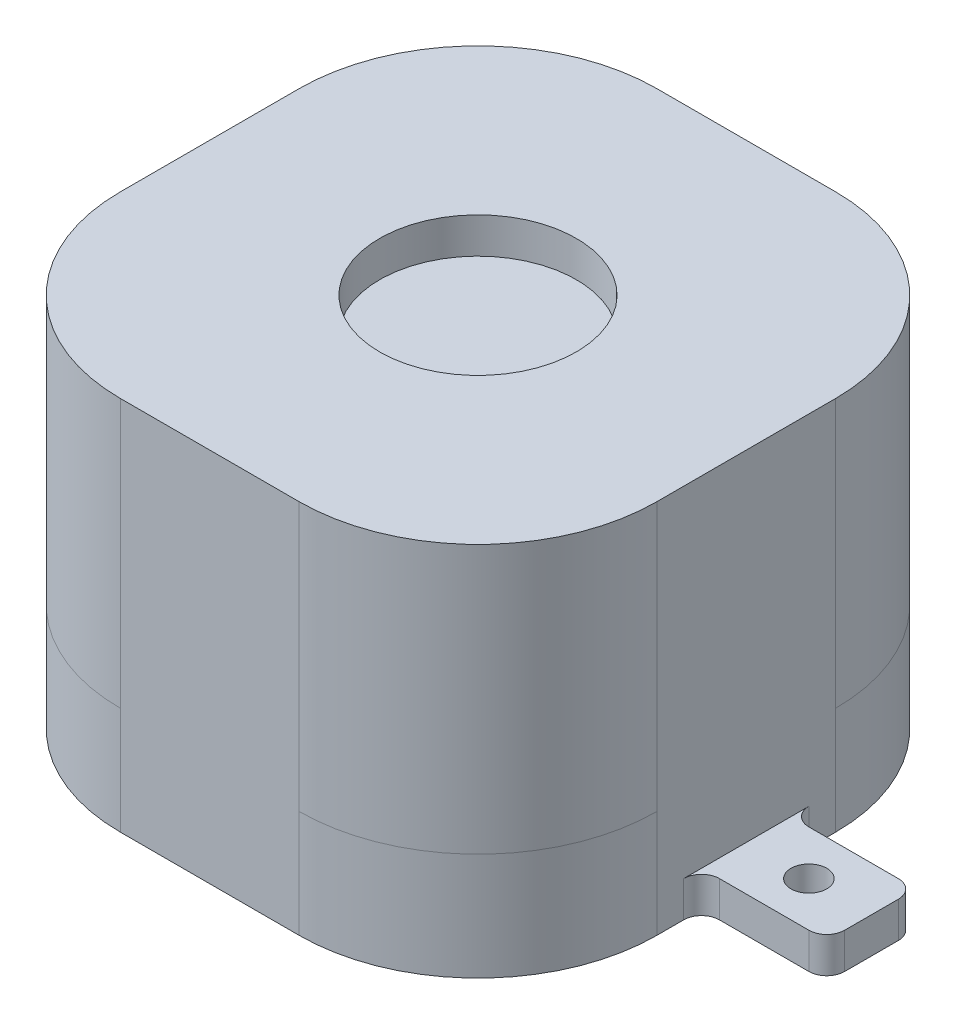
ISO-10303-21;
HEADER;
FILE_DESCRIPTION(('STEP AP214'),'2;1');
FILE_NAME('part.step','',(''),(''),'','','');
FILE_SCHEMA(('AUTOMOTIVE_DESIGN { 1 0 10303 214 1 1 1 1 }'));
ENDSEC;
DATA;
#1=APPLICATION_CONTEXT('core data for automotive mechanical design processes');
#2=APPLICATION_PROTOCOL_DEFINITION('international standard','automotive_design',2000,#1);
#3=PRODUCT_CONTEXT('',#1,'mechanical');
#4=PRODUCT('Part','Part','',(#3));
#5=PRODUCT_RELATED_PRODUCT_CATEGORY('part','',(#4));
#6=PRODUCT_DEFINITION_FORMATION('','',#4);
#7=PRODUCT_DEFINITION_CONTEXT('part definition',#1,'design');
#8=PRODUCT_DEFINITION('design','',#6,#7);
#9=PRODUCT_DEFINITION_SHAPE('','',#8);
#10=(LENGTH_UNIT() NAMED_UNIT(*) SI_UNIT(.MILLI.,.METRE.));
#11=(NAMED_UNIT(*) PLANE_ANGLE_UNIT() SI_UNIT($,.RADIAN.));
#12=(NAMED_UNIT(*) SI_UNIT($,.STERADIAN.) SOLID_ANGLE_UNIT());
#13=UNCERTAINTY_MEASURE_WITH_UNIT(LENGTH_MEASURE(1.E-05),#10,'distance_accuracy_value','');
#14=(GEOMETRIC_REPRESENTATION_CONTEXT(3) GLOBAL_UNCERTAINTY_ASSIGNED_CONTEXT((#13)) GLOBAL_UNIT_ASSIGNED_CONTEXT((#10,
#11,#12)) REPRESENTATION_CONTEXT('',''));
#15=CARTESIAN_POINT('',(0.,0.,0.));
#16=DIRECTION('',(0.,0.,1.));
#17=DIRECTION('',(1.,0.,0.));
#18=AXIS2_PLACEMENT_3D('',#15,#16,#17);
#19=CARTESIAN_POINT('',(-15.,6.,15.));
#20=DIRECTION('',(1.,0.,0.));
#21=DIRECTION('',(0.,0.,-1.));
#22=AXIS2_PLACEMENT_3D('',#19,#20,#21);
#23=PLANE('',#22);
#24=DIRECTION('',(0.,0.,1.));
#25=VECTOR('',#24,1.);
#26=CARTESIAN_POINT('',(-15.,21.,15.));
#27=LINE('',#26,#25);
#28=CARTESIAN_POINT('',(-15.,21.,-4.99999999999999));
#29=VERTEX_POINT('',#28);
#30=CARTESIAN_POINT('',(-15.,21.,5.));
#31=VERTEX_POINT('',#30);
#32=EDGE_CURVE('E424',#29,#31,#27,.T.);
#33=ORIENTED_EDGE('',*,*,#32,.F.);
#34=DIRECTION('',(0.,-1.,0.));
#35=VECTOR('',#34,1.);
#36=CARTESIAN_POINT('',(-15.,6.,-4.99999999999999));
#37=LINE('',#36,#35);
#38=CARTESIAN_POINT('',(-15.,6.,-4.99999999999999));
#39=VERTEX_POINT('',#38);
#40=EDGE_CURVE('E11',#29,#39,#37,.T.);
#41=ORIENTED_EDGE('',*,*,#40,.T.);
#42=DIRECTION('',(0.,-1.,0.));
#43=VECTOR('',#42,1.);
#44=CARTESIAN_POINT('',(-15.,6.,-4.99999999999999));
#45=LINE('',#44,#43);
#46=CARTESIAN_POINT('',(-15.,0.,-4.99999999999999));
#47=VERTEX_POINT('',#46);
#48=EDGE_CURVE('E284',#39,#47,#45,.T.);
#49=ORIENTED_EDGE('',*,*,#48,.T.);
#50=DIRECTION('',(0.,0.,1.));
#51=VECTOR('',#50,1.);
#52=CARTESIAN_POINT('',(-15.,0.,15.));
#53=LINE('',#52,#51);
#54=CARTESIAN_POINT('',(-15.,0.,-3.5));
#55=VERTEX_POINT('',#54);
#56=EDGE_CURVE('E516',#47,#55,#53,.T.);
#57=ORIENTED_EDGE('',*,*,#56,.T.);
#58=DIRECTION('',(0.,-1.,0.));
#59=VECTOR('',#58,1.);
#60=CARTESIAN_POINT('',(-15.,2.,-3.5));
#61=LINE('',#60,#59);
#62=CARTESIAN_POINT('',(-15.,2.,-3.5));
#63=VERTEX_POINT('',#62);
#64=EDGE_CURVE('E335',#55,#63,#61,.F.);
#65=ORIENTED_EDGE('',*,*,#64,.T.);
#66=DIRECTION('',(0.,0.,-1.));
#67=VECTOR('',#66,1.);
#68=CARTESIAN_POINT('',(-15.,2.,-2.5));
#69=LINE('',#68,#67);
#70=CARTESIAN_POINT('',(-15.,2.,3.5));
#71=VERTEX_POINT('',#70);
#72=EDGE_CURVE('E454',#71,#63,#69,.T.);
#73=ORIENTED_EDGE('',*,*,#72,.F.);
#74=DIRECTION('',(0.,-1.,0.));
#75=VECTOR('',#74,1.);
#76=CARTESIAN_POINT('',(-15.,0.,3.5));
#77=LINE('',#76,#75);
#78=CARTESIAN_POINT('',(-15.,0.,3.5));
#79=VERTEX_POINT('',#78);
#80=EDGE_CURVE('E339',#71,#79,#77,.T.);
#81=ORIENTED_EDGE('',*,*,#80,.T.);
#82=CARTESIAN_POINT('',(-15.,0.,5.));
#83=VERTEX_POINT('',#82);
#84=EDGE_CURVE('E505',#79,#83,#53,.T.);
#85=ORIENTED_EDGE('',*,*,#84,.T.);
#86=DIRECTION('',(0.,-1.,0.));
#87=VECTOR('',#86,1.);
#88=CARTESIAN_POINT('',(-15.,6.,5.));
#89=LINE('',#88,#87);
#90=CARTESIAN_POINT('',(-15.,6.,5.));
#91=VERTEX_POINT('',#90);
#92=EDGE_CURVE('E281',#83,#91,#89,.F.);
#93=ORIENTED_EDGE('',*,*,#92,.T.);
#94=DIRECTION('',(0.,-1.,0.));
#95=VECTOR('',#94,1.);
#96=CARTESIAN_POINT('',(-15.,6.,5.));
#97=LINE('',#96,#95);
#98=EDGE_CURVE('E50',#91,#31,#97,.F.);
#99=ORIENTED_EDGE('',*,*,#98,.T.);
#100=EDGE_LOOP('',(#33,#41,#49,#57,#65,#73,#81,#85,#93,#99));
#101=FACE_BOUND('',#100,.T.);
#102=ADVANCED_FACE('F41',(#101),#23,.F.);
#103=CARTESIAN_POINT('',(15.,6.,15.));
#104=DIRECTION('',(0.,0.,-1.));
#105=DIRECTION('',(-1.,0.,0.));
#106=AXIS2_PLACEMENT_3D('',#103,#104,#105);
#107=PLANE('',#106);
#108=DIRECTION('',(0.,-1.,0.));
#109=VECTOR('',#108,1.);
#110=CARTESIAN_POINT('',(5.,6.,15.));
#111=LINE('',#110,#109);
#112=CARTESIAN_POINT('',(5.,0.,15.));
#113=VERTEX_POINT('',#112);
#114=CARTESIAN_POINT('',(5.,6.,15.));
#115=VERTEX_POINT('',#114);
#116=EDGE_CURVE('E238',#113,#115,#111,.F.);
#117=ORIENTED_EDGE('',*,*,#116,.T.);
#118=DIRECTION('',(0.,-1.,0.));
#119=VECTOR('',#118,1.);
#120=CARTESIAN_POINT('',(5.,6.,15.));
#121=LINE('',#120,#119);
#122=CARTESIAN_POINT('',(5.,21.,15.));
#123=VERTEX_POINT('',#122);
#124=EDGE_CURVE('E250',#115,#123,#121,.F.);
#125=ORIENTED_EDGE('',*,*,#124,.T.);
#126=DIRECTION('',(1.,0.,0.));
#127=VECTOR('',#126,1.);
#128=CARTESIAN_POINT('',(15.,21.,15.));
#129=LINE('',#128,#127);
#130=CARTESIAN_POINT('',(-5.,21.,15.));
#131=VERTEX_POINT('',#130);
#132=EDGE_CURVE('E248',#131,#123,#129,.T.);
#133=ORIENTED_EDGE('',*,*,#132,.F.);
#134=DIRECTION('',(0.,-1.,0.));
#135=VECTOR('',#134,1.);
#136=CARTESIAN_POINT('',(-4.99999999999999,6.,15.));
#137=LINE('',#136,#135);
#138=CARTESIAN_POINT('',(-4.99999999999999,6.,15.));
#139=VERTEX_POINT('',#138);
#140=EDGE_CURVE('E232',#131,#139,#137,.T.);
#141=ORIENTED_EDGE('',*,*,#140,.T.);
#142=DIRECTION('',(0.,-1.,0.));
#143=VECTOR('',#142,1.);
#144=CARTESIAN_POINT('',(-4.99999999999999,6.,15.));
#145=LINE('',#144,#143);
#146=CARTESIAN_POINT('',(-4.99999999999999,0.,15.));
#147=VERTEX_POINT('',#146);
#148=EDGE_CURVE('E245',#139,#147,#145,.T.);
#149=ORIENTED_EDGE('',*,*,#148,.T.);
#150=DIRECTION('',(1.,0.,0.));
#151=VECTOR('',#150,1.);
#152=CARTESIAN_POINT('',(15.,0.,15.));
#153=LINE('',#152,#151);
#154=EDGE_CURVE('E520',#147,#113,#153,.T.);
#155=ORIENTED_EDGE('',*,*,#154,.T.);
#156=EDGE_LOOP('',(#117,#125,#133,#141,#149,#155));
#157=FACE_BOUND('',#156,.T.);
#158=ADVANCED_FACE('F243',(#157),#107,.F.);
#159=CARTESIAN_POINT('',(15.,6.,15.));
#160=DIRECTION('',(-1.,0.,0.));
#161=DIRECTION('',(0.,0.,1.));
#162=AXIS2_PLACEMENT_3D('',#159,#160,#161);
#163=PLANE('',#162);
#164=DIRECTION('',(0.,0.,-1.));
#165=VECTOR('',#164,1.);
#166=CARTESIAN_POINT('',(15.,21.,15.));
#167=LINE('',#166,#165);
#168=CARTESIAN_POINT('',(15.,21.,5.));
#169=VERTEX_POINT('',#168);
#170=CARTESIAN_POINT('',(15.,21.,-5.));
#171=VERTEX_POINT('',#170);
#172=EDGE_CURVE('E433',#169,#171,#167,.T.);
#173=ORIENTED_EDGE('',*,*,#172,.F.);
#174=DIRECTION('',(0.,-1.,0.));
#175=VECTOR('',#174,1.);
#176=CARTESIAN_POINT('',(15.,6.,5.));
#177=LINE('',#176,#175);
#178=CARTESIAN_POINT('',(15.,6.,5.));
#179=VERTEX_POINT('',#178);
#180=EDGE_CURVE('E251',#169,#179,#177,.T.);
#181=ORIENTED_EDGE('',*,*,#180,.T.);
#182=DIRECTION('',(0.,-1.,0.));
#183=VECTOR('',#182,1.);
#184=CARTESIAN_POINT('',(15.,6.,5.));
#185=LINE('',#184,#183);
#186=CARTESIAN_POINT('',(15.,0.,5.));
#187=VERTEX_POINT('',#186);
#188=EDGE_CURVE('E535',#179,#187,#185,.T.);
#189=ORIENTED_EDGE('',*,*,#188,.T.);
#190=DIRECTION('',(0.,0.,-1.));
#191=VECTOR('',#190,1.);
#192=CARTESIAN_POINT('',(15.,0.,15.));
#193=LINE('',#192,#191);
#194=CARTESIAN_POINT('',(15.,0.,3.5));
#195=VERTEX_POINT('',#194);
#196=EDGE_CURVE('E524',#187,#195,#193,.T.);
#197=ORIENTED_EDGE('',*,*,#196,.T.);
#198=DIRECTION('',(0.,-1.,0.));
#199=VECTOR('',#198,1.);
#200=CARTESIAN_POINT('',(15.,6.,3.5));
#201=LINE('',#200,#199);
#202=CARTESIAN_POINT('',(15.,2.,3.5));
#203=VERTEX_POINT('',#202);
#204=EDGE_CURVE('E320',#195,#203,#201,.F.);
#205=ORIENTED_EDGE('',*,*,#204,.T.);
#206=DIRECTION('',(0.,0.,-1.));
#207=VECTOR('',#206,1.);
#208=CARTESIAN_POINT('',(15.,2.,-2.5));
#209=LINE('',#208,#207);
#210=CARTESIAN_POINT('',(15.,2.,-3.5));
#211=VERTEX_POINT('',#210);
#212=EDGE_CURVE('E489',#203,#211,#209,.T.);
#213=ORIENTED_EDGE('',*,*,#212,.T.);
#214=DIRECTION('',(0.,-1.,0.));
#215=VECTOR('',#214,1.);
#216=CARTESIAN_POINT('',(15.,6.,-3.5));
#217=LINE('',#216,#215);
#218=CARTESIAN_POINT('',(15.,0.,-3.5));
#219=VERTEX_POINT('',#218);
#220=EDGE_CURVE('E324',#211,#219,#217,.T.);
#221=ORIENTED_EDGE('',*,*,#220,.T.);
#222=CARTESIAN_POINT('',(15.,0.,-5.));
#223=VERTEX_POINT('',#222);
#224=EDGE_CURVE('E523',#219,#223,#193,.T.);
#225=ORIENTED_EDGE('',*,*,#224,.T.);
#226=DIRECTION('',(0.,-1.,0.));
#227=VECTOR('',#226,1.);
#228=CARTESIAN_POINT('',(15.,6.,-5.));
#229=LINE('',#228,#227);
#230=CARTESIAN_POINT('',(15.,6.,-5.));
#231=VERTEX_POINT('',#230);
#232=EDGE_CURVE('E532',#223,#231,#229,.F.);
#233=ORIENTED_EDGE('',*,*,#232,.T.);
#234=DIRECTION('',(0.,-1.,0.));
#235=VECTOR('',#234,1.);
#236=CARTESIAN_POINT('',(15.,6.,-5.));
#237=LINE('',#236,#235);
#238=EDGE_CURVE('E396',#231,#171,#237,.F.);
#239=ORIENTED_EDGE('',*,*,#238,.T.);
#240=EDGE_LOOP('',(#173,#181,#189,#197,#205,#213,#221,#225,#233,#239));
#241=FACE_BOUND('',#240,.T.);
#242=ADVANCED_FACE('F558',(#241),#163,.F.);
#243=CARTESIAN_POINT('',(15.,6.,-15.));
#244=DIRECTION('',(0.,0.,1.));
#245=DIRECTION('',(1.,0.,0.));
#246=AXIS2_PLACEMENT_3D('',#243,#244,#245);
#247=PLANE('',#246);
#248=DIRECTION('',(-1.,0.,0.));
#249=VECTOR('',#248,1.);
#250=CARTESIAN_POINT('',(15.,21.,-15.));
#251=LINE('',#250,#249);
#252=CARTESIAN_POINT('',(5.,21.,-15.));
#253=VERTEX_POINT('',#252);
#254=CARTESIAN_POINT('',(-5.,21.,-15.));
#255=VERTEX_POINT('',#254);
#256=EDGE_CURVE('E442',#253,#255,#251,.T.);
#257=ORIENTED_EDGE('',*,*,#256,.F.);
#258=DIRECTION('',(0.,-1.,0.));
#259=VECTOR('',#258,1.);
#260=CARTESIAN_POINT('',(5.,6.,-15.));
#261=LINE('',#260,#259);
#262=CARTESIAN_POINT('',(5.,6.,-15.));
#263=VERTEX_POINT('',#262);
#264=EDGE_CURVE('E417',#253,#263,#261,.T.);
#265=ORIENTED_EDGE('',*,*,#264,.T.);
#266=DIRECTION('',(0.,-1.,0.));
#267=VECTOR('',#266,1.);
#268=CARTESIAN_POINT('',(5.,6.,-15.));
#269=LINE('',#268,#267);
#270=CARTESIAN_POINT('',(5.,0.,-15.));
#271=VERTEX_POINT('',#270);
#272=EDGE_CURVE('E277',#263,#271,#269,.T.);
#273=ORIENTED_EDGE('',*,*,#272,.T.);
#274=DIRECTION('',(-1.,0.,0.));
#275=VECTOR('',#274,1.);
#276=CARTESIAN_POINT('',(15.,0.,-15.));
#277=LINE('',#276,#275);
#278=CARTESIAN_POINT('',(-4.99999999999999,0.,-15.));
#279=VERTEX_POINT('',#278);
#280=EDGE_CURVE('E528',#271,#279,#277,.T.);
#281=ORIENTED_EDGE('',*,*,#280,.T.);
#282=DIRECTION('',(0.,-1.,0.));
#283=VECTOR('',#282,1.);
#284=CARTESIAN_POINT('',(-5.,6.,-15.));
#285=LINE('',#284,#283);
#286=CARTESIAN_POINT('',(-4.99999999999999,6.,-15.));
#287=VERTEX_POINT('',#286);
#288=EDGE_CURVE('E274',#279,#287,#285,.F.);
#289=ORIENTED_EDGE('',*,*,#288,.T.);
#290=DIRECTION('',(0.,-1.,0.));
#291=VECTOR('',#290,1.);
#292=CARTESIAN_POINT('',(-5.,6.,-15.));
#293=LINE('',#292,#291);
#294=EDGE_CURVE('E57',#287,#255,#293,.F.);
#295=ORIENTED_EDGE('',*,*,#294,.T.);
#296=EDGE_LOOP('',(#257,#265,#273,#281,#289,#295));
#297=FACE_BOUND('',#296,.T.);
#298=ADVANCED_FACE('F649',(#297),#247,.F.);
#299=CARTESIAN_POINT('',(0.,0.,0.));
#300=DIRECTION('',(0.,1.,0.));
#301=DIRECTION('',(0.,0.,1.));
#302=AXIS2_PLACEMENT_3D('',#299,#300,#301);
#303=PLANE('',#302);
#304=DIRECTION('',(1.,0.,0.));
#305=VECTOR('',#304,1.);
#306=CARTESIAN_POINT('',(15.,0.,-2.5));
#307=LINE('',#306,#305);
#308=CARTESIAN_POINT('',(16.,0.,-2.5));
#309=VERTEX_POINT('',#308);
#310=CARTESIAN_POINT('',(21.,0.,-2.5));
#311=VERTEX_POINT('',#310);
#312=EDGE_CURVE('E485',#309,#311,#307,.T.);
#313=ORIENTED_EDGE('',*,*,#312,.T.);
#314=CARTESIAN_POINT('',(21.,0.,-1.5));
#315=DIRECTION('',(0.,1.,0.));
#316=DIRECTION('',(0.,0.,1.));
#317=AXIS2_PLACEMENT_3D('',#314,#315,#316);
#318=CIRCLE('',#317,1.);
#319=CARTESIAN_POINT('',(22.,0.,-1.5));
#320=VERTEX_POINT('',#319);
#321=EDGE_CURVE('E304',#311,#320,#318,.F.);
#322=ORIENTED_EDGE('',*,*,#321,.T.);
#323=DIRECTION('',(0.,0.,1.));
#324=VECTOR('',#323,1.);
#325=CARTESIAN_POINT('',(22.,0.,-2.5));
#326=LINE('',#325,#324);
#327=CARTESIAN_POINT('',(22.,0.,1.5));
#328=VERTEX_POINT('',#327);
#329=EDGE_CURVE('E509',#320,#328,#326,.T.);
#330=ORIENTED_EDGE('',*,*,#329,.T.);
#331=CARTESIAN_POINT('',(21.,0.,1.5));
#332=DIRECTION('',(0.,1.,0.));
#333=DIRECTION('',(0.,0.,1.));
#334=AXIS2_PLACEMENT_3D('',#331,#332,#333);
#335=CIRCLE('',#334,1.);
#336=CARTESIAN_POINT('',(21.,0.,2.5));
#337=VERTEX_POINT('',#336);
#338=EDGE_CURVE('E301',#328,#337,#335,.F.);
#339=ORIENTED_EDGE('',*,*,#338,.T.);
#340=DIRECTION('',(-1.,0.,0.));
#341=VECTOR('',#340,1.);
#342=CARTESIAN_POINT('',(15.,0.,2.5));
#343=LINE('',#342,#341);
#344=CARTESIAN_POINT('',(16.,0.,2.5));
#345=VERTEX_POINT('',#344);
#346=EDGE_CURVE('E493',#337,#345,#343,.T.);
#347=ORIENTED_EDGE('',*,*,#346,.T.);
#348=CARTESIAN_POINT('',(16.,0.,3.5));
#349=DIRECTION('',(0.,1.,0.));
#350=DIRECTION('',(0.,0.,1.));
#351=AXIS2_PLACEMENT_3D('',#348,#349,#350);
#352=CIRCLE('',#351,1.);
#353=EDGE_CURVE('E377',#345,#195,#352,.T.);
#354=ORIENTED_EDGE('',*,*,#353,.T.);
#355=ORIENTED_EDGE('',*,*,#196,.F.);
#356=CARTESIAN_POINT('',(5.,0.,5.));
#357=DIRECTION('',(0.,1.,0.));
#358=DIRECTION('',(0.,0.,1.));
#359=AXIS2_PLACEMENT_3D('',#356,#357,#358);
#360=CIRCLE('',#359,10.);
#361=EDGE_CURVE('E257',#187,#113,#360,.F.);
#362=ORIENTED_EDGE('',*,*,#361,.T.);
#363=ORIENTED_EDGE('',*,*,#154,.F.);
#364=CARTESIAN_POINT('',(-5.,0.,5.));
#365=DIRECTION('',(0.,1.,0.));
#366=DIRECTION('',(0.,0.,1.));
#367=AXIS2_PLACEMENT_3D('',#364,#365,#366);
#368=CIRCLE('',#367,10.);
#369=EDGE_CURVE('E255',#147,#83,#368,.F.);
#370=ORIENTED_EDGE('',*,*,#369,.T.);
#371=ORIENTED_EDGE('',*,*,#84,.F.);
#372=CARTESIAN_POINT('',(-16.,0.,3.5));
#373=DIRECTION('',(0.,1.,0.));
#374=DIRECTION('',(0.,0.,1.));
#375=AXIS2_PLACEMENT_3D('',#372,#373,#374);
#376=CIRCLE('',#375,1.);
#377=CARTESIAN_POINT('',(-16.,0.,2.5));
#378=VERTEX_POINT('',#377);
#379=EDGE_CURVE('E383',#79,#378,#376,.T.);
#380=ORIENTED_EDGE('',*,*,#379,.T.);
#381=DIRECTION('',(1.,0.,0.));
#382=VECTOR('',#381,1.);
#383=CARTESIAN_POINT('',(-15.,0.,2.5));
#384=LINE('',#383,#382);
#385=CARTESIAN_POINT('',(-21.,0.,2.5));
#386=VERTEX_POINT('',#385);
#387=EDGE_CURVE('E450',#386,#378,#384,.T.);
#388=ORIENTED_EDGE('',*,*,#387,.F.);
#389=CARTESIAN_POINT('',(-21.,0.,1.5));
#390=DIRECTION('',(0.,1.,0.));
#391=DIRECTION('',(0.,0.,1.));
#392=AXIS2_PLACEMENT_3D('',#389,#390,#391);
#393=CIRCLE('',#392,1.);
#394=CARTESIAN_POINT('',(-22.,0.,1.5));
#395=VERTEX_POINT('',#394);
#396=EDGE_CURVE('E298',#386,#395,#393,.F.);
#397=ORIENTED_EDGE('',*,*,#396,.T.);
#398=DIRECTION('',(0.,0.,1.));
#399=VECTOR('',#398,1.);
#400=CARTESIAN_POINT('',(-22.,0.,-2.5));
#401=LINE('',#400,#399);
#402=CARTESIAN_POINT('',(-22.,0.,-1.5));
#403=VERTEX_POINT('',#402);
#404=EDGE_CURVE('E474',#403,#395,#401,.T.);
#405=ORIENTED_EDGE('',*,*,#404,.F.);
#406=CARTESIAN_POINT('',(-21.,0.,-1.5));
#407=DIRECTION('',(0.,1.,0.));
#408=DIRECTION('',(0.,0.,1.));
#409=AXIS2_PLACEMENT_3D('',#406,#407,#408);
#410=CIRCLE('',#409,1.);
#411=CARTESIAN_POINT('',(-21.,0.,-2.5));
#412=VERTEX_POINT('',#411);
#413=EDGE_CURVE('E295',#403,#412,#410,.F.);
#414=ORIENTED_EDGE('',*,*,#413,.T.);
#415=DIRECTION('',(-1.,0.,0.));
#416=VECTOR('',#415,1.);
#417=CARTESIAN_POINT('',(-15.,0.,-2.5));
#418=LINE('',#417,#416);
#419=CARTESIAN_POINT('',(-16.,0.,-2.5));
#420=VERTEX_POINT('',#419);
#421=EDGE_CURVE('E458',#420,#412,#418,.T.);
#422=ORIENTED_EDGE('',*,*,#421,.F.);
#423=CARTESIAN_POINT('',(-16.,0.,-3.5));
#424=DIRECTION('',(0.,1.,0.));
#425=DIRECTION('',(0.,0.,1.));
#426=AXIS2_PLACEMENT_3D('',#423,#424,#425);
#427=CIRCLE('',#426,1.);
#428=EDGE_CURVE('E390',#420,#55,#427,.T.);
#429=ORIENTED_EDGE('',*,*,#428,.T.);
#430=ORIENTED_EDGE('',*,*,#56,.F.);
#431=CARTESIAN_POINT('',(-5.,0.,-4.99999999999999));
#432=DIRECTION('',(0.,1.,0.));
#433=DIRECTION('',(0.,0.,1.));
#434=AXIS2_PLACEMENT_3D('',#431,#432,#433);
#435=CIRCLE('',#434,10.);
#436=EDGE_CURVE('E541',#47,#279,#435,.F.);
#437=ORIENTED_EDGE('',*,*,#436,.T.);
#438=ORIENTED_EDGE('',*,*,#280,.F.);
#439=CARTESIAN_POINT('',(5.,0.,-4.99999999999999));
#440=DIRECTION('',(0.,1.,0.));
#441=DIRECTION('',(0.,0.,1.));
#442=AXIS2_PLACEMENT_3D('',#439,#440,#441);
#443=CIRCLE('',#442,10.);
#444=EDGE_CURVE('E262',#271,#223,#443,.F.);
#445=ORIENTED_EDGE('',*,*,#444,.T.);
#446=ORIENTED_EDGE('',*,*,#224,.F.);
#447=CARTESIAN_POINT('',(16.,0.,-3.5));
#448=DIRECTION('',(0.,1.,0.));
#449=DIRECTION('',(0.,0.,1.));
#450=AXIS2_PLACEMENT_3D('',#447,#448,#449);
#451=CIRCLE('',#450,1.);
#452=EDGE_CURVE('E370',#219,#309,#451,.T.);
#453=ORIENTED_EDGE('',*,*,#452,.T.);
#454=EDGE_LOOP('',(#313,#322,#330,#339,#347,#354,#355,#362,#363,#370,#371,#380,#388,#397,#405,
#414,#422,#429,#430,#437,#438,#445,#446,#453));
#455=FACE_BOUND('',#454,.T.);
#456=CARTESIAN_POINT('',(18.5,0.,0.));
#457=DIRECTION('',(0.,-1.,0.));
#458=DIRECTION('',(0.,0.,-1.));
#459=AXIS2_PLACEMENT_3D('',#456,#457,#458);
#460=CIRCLE('',#459,1.);
#461=CARTESIAN_POINT('',(18.5,0.,-1.));
#462=VERTEX_POINT('',#461);
#463=EDGE_CURVE('E470',#462,#462,#460,.T.);
#464=ORIENTED_EDGE('',*,*,#463,.F.);
#465=EDGE_LOOP('',(#464));
#466=FACE_BOUND('',#465,.T.);
#467=CARTESIAN_POINT('',(-18.5,0.,0.));
#468=DIRECTION('',(0.,1.,0.));
#469=DIRECTION('',(0.,0.,-1.));
#470=AXIS2_PLACEMENT_3D('',#467,#468,#469);
#471=CIRCLE('',#470,1.);
#472=CARTESIAN_POINT('',(-18.5,0.,-1.));
#473=VERTEX_POINT('',#472);
#474=EDGE_CURVE('E445',#473,#473,#471,.T.);
#475=ORIENTED_EDGE('',*,*,#474,.T.);
#476=EDGE_LOOP('',(#475));
#477=FACE_BOUND('',#476,.T.);
#478=ADVANCED_FACE('F549',(#455,#466,#477),#303,.F.);
#479=CARTESIAN_POINT('',(5.,6.,5.));
#480=DIRECTION('',(0.,-1.,0.));
#481=DIRECTION('',(0.,0.,-1.));
#482=AXIS2_PLACEMENT_3D('',#479,#480,#481);
#483=CYLINDRICAL_SURFACE('',#482,10.);
#484=CARTESIAN_POINT('',(5.,6.,5.));
#485=DIRECTION('',(0.,1.,0.));
#486=DIRECTION('',(0.,0.,1.));
#487=AXIS2_PLACEMENT_3D('',#484,#485,#486);
#488=CIRCLE('',#487,10.);
#489=EDGE_CURVE('E271',#115,#179,#488,.T.);
#490=ORIENTED_EDGE('',*,*,#489,.F.);
#491=ORIENTED_EDGE('',*,*,#116,.F.);
#492=ORIENTED_EDGE('',*,*,#361,.F.);
#493=ORIENTED_EDGE('',*,*,#188,.F.);
#494=EDGE_LOOP('',(#490,#491,#492,#493));
#495=FACE_BOUND('',#494,.T.);
#496=ADVANCED_FACE('F568',(#495),#483,.T.);
#497=CARTESIAN_POINT('',(5.,6.,-4.99999999999999));
#498=DIRECTION('',(0.,-1.,0.));
#499=DIRECTION('',(0.,0.,-1.));
#500=AXIS2_PLACEMENT_3D('',#497,#498,#499);
#501=CYLINDRICAL_SURFACE('',#500,10.);
#502=CARTESIAN_POINT('',(5.,6.,-4.99999999999999));
#503=DIRECTION('',(0.,1.,0.));
#504=DIRECTION('',(0.,0.,1.));
#505=AXIS2_PLACEMENT_3D('',#502,#503,#504);
#506=CIRCLE('',#505,10.);
#507=EDGE_CURVE('E268',#231,#263,#506,.T.);
#508=ORIENTED_EDGE('',*,*,#507,.F.);
#509=ORIENTED_EDGE('',*,*,#232,.F.);
#510=ORIENTED_EDGE('',*,*,#444,.F.);
#511=ORIENTED_EDGE('',*,*,#272,.F.);
#512=EDGE_LOOP('',(#508,#509,#510,#511));
#513=FACE_BOUND('',#512,.T.);
#514=ADVANCED_FACE('F554',(#513),#501,.T.);
#515=CARTESIAN_POINT('',(-5.,6.,-4.99999999999999));
#516=DIRECTION('',(0.,-1.,0.));
#517=DIRECTION('',(0.,0.,-1.));
#518=AXIS2_PLACEMENT_3D('',#515,#516,#517);
#519=CYLINDRICAL_SURFACE('',#518,10.);
#520=CARTESIAN_POINT('',(-5.,6.,-4.99999999999999));
#521=DIRECTION('',(0.,1.,0.));
#522=DIRECTION('',(0.,0.,1.));
#523=AXIS2_PLACEMENT_3D('',#520,#521,#522);
#524=CIRCLE('',#523,10.);
#525=EDGE_CURVE('E237',#287,#39,#524,.T.);
#526=ORIENTED_EDGE('',*,*,#525,.F.);
#527=ORIENTED_EDGE('',*,*,#288,.F.);
#528=ORIENTED_EDGE('',*,*,#436,.F.);
#529=ORIENTED_EDGE('',*,*,#48,.F.);
#530=EDGE_LOOP('',(#526,#527,#528,#529));
#531=FACE_BOUND('',#530,.T.);
#532=ADVANCED_FACE('F629',(#531),#519,.T.);
#533=CARTESIAN_POINT('',(-5.,6.,5.));
#534=DIRECTION('',(0.,-1.,0.));
#535=DIRECTION('',(0.,0.,-1.));
#536=AXIS2_PLACEMENT_3D('',#533,#534,#535);
#537=CYLINDRICAL_SURFACE('',#536,10.);
#538=CARTESIAN_POINT('',(-5.,6.,5.));
#539=DIRECTION('',(0.,1.,0.));
#540=DIRECTION('',(0.,0.,1.));
#541=AXIS2_PLACEMENT_3D('',#538,#539,#540);
#542=CIRCLE('',#541,10.);
#543=EDGE_CURVE('E229',#91,#139,#542,.T.);
#544=ORIENTED_EDGE('',*,*,#543,.F.);
#545=ORIENTED_EDGE('',*,*,#92,.F.);
#546=ORIENTED_EDGE('',*,*,#369,.F.);
#547=ORIENTED_EDGE('',*,*,#148,.F.);
#548=EDGE_LOOP('',(#544,#545,#546,#547));
#549=FACE_BOUND('',#548,.T.);
#550=ADVANCED_FACE('F253',(#549),#537,.T.);
#551=CARTESIAN_POINT('',(15.,2.,2.5));
#552=DIRECTION('',(0.,0.,1.));
#553=DIRECTION('',(1.,0.,0.));
#554=AXIS2_PLACEMENT_3D('',#551,#552,#553);
#555=PLANE('',#554);
#556=ORIENTED_EDGE('',*,*,#346,.F.);
#557=DIRECTION('',(0.,-1.,0.));
#558=VECTOR('',#557,1.);
#559=CARTESIAN_POINT('',(21.,2.,2.5));
#560=LINE('',#559,#558);
#561=CARTESIAN_POINT('',(21.,2.,2.5));
#562=VERTEX_POINT('',#561);
#563=EDGE_CURVE('E332',#337,#562,#560,.F.);
#564=ORIENTED_EDGE('',*,*,#563,.T.);
#565=DIRECTION('',(-1.,0.,0.));
#566=VECTOR('',#565,1.);
#567=CARTESIAN_POINT('',(15.,2.,2.5));
#568=LINE('',#567,#566);
#569=CARTESIAN_POINT('',(16.,2.,2.5));
#570=VERTEX_POINT('',#569);
#571=EDGE_CURVE('E501',#562,#570,#568,.T.);
#572=ORIENTED_EDGE('',*,*,#571,.T.);
#573=DIRECTION('',(0.,-1.,0.));
#574=VECTOR('',#573,1.);
#575=CARTESIAN_POINT('',(16.,2.,2.5));
#576=LINE('',#575,#574);
#577=EDGE_CURVE('E328',#570,#345,#576,.T.);
#578=ORIENTED_EDGE('',*,*,#577,.T.);
#579=EDGE_LOOP('',(#556,#564,#572,#578));
#580=FACE_BOUND('',#579,.T.);
#581=ADVANCED_FACE('F582',(#580),#555,.T.);
#582=CARTESIAN_POINT('',(22.,2.,-2.5));
#583=DIRECTION('',(1.,0.,0.));
#584=DIRECTION('',(0.,0.,-1.));
#585=AXIS2_PLACEMENT_3D('',#582,#583,#584);
#586=PLANE('',#585);
#587=ORIENTED_EDGE('',*,*,#329,.F.);
#588=DIRECTION('',(0.,-1.,0.));
#589=VECTOR('',#588,1.);
#590=CARTESIAN_POINT('',(22.,2.,-1.5));
#591=LINE('',#590,#589);
#592=CARTESIAN_POINT('',(22.,2.,-1.5));
#593=VERTEX_POINT('',#592);
#594=EDGE_CURVE('E311',#320,#593,#591,.F.);
#595=ORIENTED_EDGE('',*,*,#594,.T.);
#596=DIRECTION('',(0.,0.,1.));
#597=VECTOR('',#596,1.);
#598=CARTESIAN_POINT('',(22.,2.,-2.5));
#599=LINE('',#598,#597);
#600=CARTESIAN_POINT('',(22.,2.,1.5));
#601=VERTEX_POINT('',#600);
#602=EDGE_CURVE('E497',#593,#601,#599,.T.);
#603=ORIENTED_EDGE('',*,*,#602,.T.);
#604=DIRECTION('',(0.,-1.,0.));
#605=VECTOR('',#604,1.);
#606=CARTESIAN_POINT('',(22.,2.,1.5));
#607=LINE('',#606,#605);
#608=EDGE_CURVE('E307',#601,#328,#607,.T.);
#609=ORIENTED_EDGE('',*,*,#608,.T.);
#610=EDGE_LOOP('',(#587,#595,#603,#609));
#611=FACE_BOUND('',#610,.T.);
#612=ADVANCED_FACE('F594',(#611),#586,.T.);
#613=CARTESIAN_POINT('',(15.,2.,-2.5));
#614=DIRECTION('',(0.,0.,-1.));
#615=DIRECTION('',(-1.,0.,0.));
#616=AXIS2_PLACEMENT_3D('',#613,#614,#615);
#617=PLANE('',#616);
#618=DIRECTION('',(1.,0.,0.));
#619=VECTOR('',#618,1.);
#620=CARTESIAN_POINT('',(15.,2.,-2.5));
#621=LINE('',#620,#619);
#622=CARTESIAN_POINT('',(16.,2.,-2.5));
#623=VERTEX_POINT('',#622);
#624=CARTESIAN_POINT('',(21.,2.,-2.5));
#625=VERTEX_POINT('',#624);
#626=EDGE_CURVE('E492',#623,#625,#621,.T.);
#627=ORIENTED_EDGE('',*,*,#626,.T.);
#628=DIRECTION('',(0.,-1.,0.));
#629=VECTOR('',#628,1.);
#630=CARTESIAN_POINT('',(21.,2.,-2.5));
#631=LINE('',#630,#629);
#632=EDGE_CURVE('E291',#625,#311,#631,.T.);
#633=ORIENTED_EDGE('',*,*,#632,.T.);
#634=ORIENTED_EDGE('',*,*,#312,.F.);
#635=DIRECTION('',(0.,-1.,0.));
#636=VECTOR('',#635,1.);
#637=CARTESIAN_POINT('',(16.,2.,-2.5));
#638=LINE('',#637,#636);
#639=EDGE_CURVE('E288',#309,#623,#638,.F.);
#640=ORIENTED_EDGE('',*,*,#639,.T.);
#641=EDGE_LOOP('',(#627,#633,#634,#640));
#642=FACE_BOUND('',#641,.T.);
#643=ADVANCED_FACE('F602',(#642),#617,.T.);
#644=CARTESIAN_POINT('',(0.,2.,0.));
#645=DIRECTION('',(0.,1.,0.));
#646=DIRECTION('',(0.,0.,1.));
#647=AXIS2_PLACEMENT_3D('',#644,#645,#646);
#648=PLANE('',#647);
#649=CARTESIAN_POINT('',(18.5,2.,0.));
#650=DIRECTION('',(0.,-1.,0.));
#651=DIRECTION('',(0.,0.,-1.));
#652=AXIS2_PLACEMENT_3D('',#649,#650,#651);
#653=CIRCLE('',#652,1.);
#654=CARTESIAN_POINT('',(18.5,2.,-1.));
#655=VERTEX_POINT('',#654);
#656=EDGE_CURVE('E481',#655,#655,#653,.T.);
#657=ORIENTED_EDGE('',*,*,#656,.T.);
#658=EDGE_LOOP('',(#657));
#659=FACE_BOUND('',#658,.T.);
#660=ORIENTED_EDGE('',*,*,#602,.F.);
#661=CARTESIAN_POINT('',(21.,2.,-1.5));
#662=DIRECTION('',(0.,1.,0.));
#663=DIRECTION('',(0.,0.,1.));
#664=AXIS2_PLACEMENT_3D('',#661,#662,#663);
#665=CIRCLE('',#664,1.);
#666=EDGE_CURVE('E317',#593,#625,#665,.T.);
#667=ORIENTED_EDGE('',*,*,#666,.T.);
#668=ORIENTED_EDGE('',*,*,#626,.F.);
#669=CARTESIAN_POINT('',(16.,2.,-3.5));
#670=DIRECTION('',(0.,1.,0.));
#671=DIRECTION('',(0.,0.,1.));
#672=AXIS2_PLACEMENT_3D('',#669,#670,#671);
#673=CIRCLE('',#672,1.);
#674=EDGE_CURVE('E373',#623,#211,#673,.F.);
#675=ORIENTED_EDGE('',*,*,#674,.T.);
#676=ORIENTED_EDGE('',*,*,#212,.F.);
#677=CARTESIAN_POINT('',(16.,2.,3.5));
#678=DIRECTION('',(0.,1.,0.));
#679=DIRECTION('',(0.,0.,1.));
#680=AXIS2_PLACEMENT_3D('',#677,#678,#679);
#681=CIRCLE('',#680,1.);
#682=EDGE_CURVE('E380',#203,#570,#681,.F.);
#683=ORIENTED_EDGE('',*,*,#682,.T.);
#684=ORIENTED_EDGE('',*,*,#571,.F.);
#685=CARTESIAN_POINT('',(21.,2.,1.5));
#686=DIRECTION('',(0.,1.,0.));
#687=DIRECTION('',(0.,0.,1.));
#688=AXIS2_PLACEMENT_3D('',#685,#686,#687);
#689=CIRCLE('',#688,1.);
#690=EDGE_CURVE('E314',#562,#601,#689,.T.);
#691=ORIENTED_EDGE('',*,*,#690,.T.);
#692=EDGE_LOOP('',(#660,#667,#668,#675,#676,#683,#684,#691));
#693=FACE_BOUND('',#692,.T.);
#694=ADVANCED_FACE('F588',(#659,#693),#648,.T.);
#695=CARTESIAN_POINT('',(18.5,2.,0.));
#696=DIRECTION('',(0.,-1.,0.));
#697=DIRECTION('',(0.,0.,-1.));
#698=AXIS2_PLACEMENT_3D('',#695,#696,#697);
#699=CYLINDRICAL_SURFACE('',#698,1.);
#700=ORIENTED_EDGE('',*,*,#656,.F.);
#701=EDGE_LOOP('',(#700));
#702=FACE_BOUND('',#701,.T.);
#703=ORIENTED_EDGE('',*,*,#463,.T.);
#704=EDGE_LOOP('',(#703));
#705=FACE_BOUND('',#704,.T.);
#706=ADVANCED_FACE('F760',(#702,#705),#699,.F.);
#707=CARTESIAN_POINT('',(0.,2.,0.));
#708=DIRECTION('',(0.,1.,0.));
#709=DIRECTION('',(0.,0.,1.));
#710=AXIS2_PLACEMENT_3D('',#707,#708,#709);
#711=PLANE('',#710);
#712=DIRECTION('',(0.,0.,1.));
#713=VECTOR('',#712,1.);
#714=CARTESIAN_POINT('',(-22.,2.,-2.5));
#715=LINE('',#714,#713);
#716=CARTESIAN_POINT('',(-22.,2.,-1.5));
#717=VERTEX_POINT('',#716);
#718=CARTESIAN_POINT('',(-22.,2.,1.5));
#719=VERTEX_POINT('',#718);
#720=EDGE_CURVE('E462',#717,#719,#715,.T.);
#721=ORIENTED_EDGE('',*,*,#720,.T.);
#722=CARTESIAN_POINT('',(-21.,2.,1.5));
#723=DIRECTION('',(0.,1.,0.));
#724=DIRECTION('',(0.,0.,1.));
#725=AXIS2_PLACEMENT_3D('',#722,#723,#724);
#726=CIRCLE('',#725,1.);
#727=CARTESIAN_POINT('',(-21.,2.,2.5));
#728=VERTEX_POINT('',#727);
#729=EDGE_CURVE('E360',#719,#728,#726,.T.);
#730=ORIENTED_EDGE('',*,*,#729,.T.);
#731=DIRECTION('',(1.,0.,0.));
#732=VECTOR('',#731,1.);
#733=CARTESIAN_POINT('',(-15.,2.,2.5));
#734=LINE('',#733,#732);
#735=CARTESIAN_POINT('',(-16.,2.,2.5));
#736=VERTEX_POINT('',#735);
#737=EDGE_CURVE('E457',#728,#736,#734,.T.);
#738=ORIENTED_EDGE('',*,*,#737,.T.);
#739=CARTESIAN_POINT('',(-16.,2.,3.5));
#740=DIRECTION('',(0.,1.,0.));
#741=DIRECTION('',(0.,0.,1.));
#742=AXIS2_PLACEMENT_3D('',#739,#740,#741);
#743=CIRCLE('',#742,1.);
#744=EDGE_CURVE('E386',#736,#71,#743,.F.);
#745=ORIENTED_EDGE('',*,*,#744,.T.);
#746=ORIENTED_EDGE('',*,*,#72,.T.);
#747=CARTESIAN_POINT('',(-16.,2.,-3.5));
#748=DIRECTION('',(0.,1.,0.));
#749=DIRECTION('',(0.,0.,1.));
#750=AXIS2_PLACEMENT_3D('',#747,#748,#749);
#751=CIRCLE('',#750,1.);
#752=CARTESIAN_POINT('',(-16.,2.,-2.5));
#753=VERTEX_POINT('',#752);
#754=EDGE_CURVE('E393',#63,#753,#751,.F.);
#755=ORIENTED_EDGE('',*,*,#754,.T.);
#756=DIRECTION('',(-1.,0.,0.));
#757=VECTOR('',#756,1.);
#758=CARTESIAN_POINT('',(-15.,2.,-2.5));
#759=LINE('',#758,#757);
#760=CARTESIAN_POINT('',(-21.,2.,-2.5));
#761=VERTEX_POINT('',#760);
#762=EDGE_CURVE('E466',#753,#761,#759,.T.);
#763=ORIENTED_EDGE('',*,*,#762,.T.);
#764=CARTESIAN_POINT('',(-21.,2.,-1.5));
#765=DIRECTION('',(0.,1.,0.));
#766=DIRECTION('',(0.,0.,1.));
#767=AXIS2_PLACEMENT_3D('',#764,#765,#766);
#768=CIRCLE('',#767,1.);
#769=EDGE_CURVE('E357',#761,#717,#768,.T.);
#770=ORIENTED_EDGE('',*,*,#769,.T.);
#771=EDGE_LOOP('',(#721,#730,#738,#745,#746,#755,#763,#770));
#772=FACE_BOUND('',#771,.T.);
#773=CARTESIAN_POINT('',(-18.5,2.,0.));
#774=DIRECTION('',(0.,1.,0.));
#775=DIRECTION('',(0.,0.,-1.));
#776=AXIS2_PLACEMENT_3D('',#773,#774,#775);
#777=CIRCLE('',#776,1.);
#778=CARTESIAN_POINT('',(-18.5,2.,-1.));
#779=VERTEX_POINT('',#778);
#780=EDGE_CURVE('E446',#779,#779,#777,.T.);
#781=ORIENTED_EDGE('',*,*,#780,.F.);
#782=EDGE_LOOP('',(#781));
#783=FACE_BOUND('',#782,.T.);
#784=ADVANCED_FACE('F756',(#772,#783),#711,.T.);
#785=CARTESIAN_POINT('',(-15.,2.,-2.5));
#786=DIRECTION('',(0.,0.,1.));
#787=DIRECTION('',(1.,0.,0.));
#788=AXIS2_PLACEMENT_3D('',#785,#786,#787);
#789=PLANE('',#788);
#790=ORIENTED_EDGE('',*,*,#762,.F.);
#791=DIRECTION('',(0.,-1.,0.));
#792=VECTOR('',#791,1.);
#793=CARTESIAN_POINT('',(-16.,0.,-2.5));
#794=LINE('',#793,#792);
#795=EDGE_CURVE('E366',#753,#420,#794,.T.);
#796=ORIENTED_EDGE('',*,*,#795,.T.);
#797=ORIENTED_EDGE('',*,*,#421,.T.);
#798=DIRECTION('',(0.,-1.,0.));
#799=VECTOR('',#798,1.);
#800=CARTESIAN_POINT('',(-21.,2.,-2.5));
#801=LINE('',#800,#799);
#802=EDGE_CURVE('E363',#412,#761,#801,.F.);
#803=ORIENTED_EDGE('',*,*,#802,.T.);
#804=EDGE_LOOP('',(#790,#796,#797,#803));
#805=FACE_BOUND('',#804,.T.);
#806=ADVANCED_FACE('F759',(#805),#789,.F.);
#807=CARTESIAN_POINT('',(-22.,2.,-2.5));
#808=DIRECTION('',(1.,0.,0.));
#809=DIRECTION('',(0.,0.,-1.));
#810=AXIS2_PLACEMENT_3D('',#807,#808,#809);
#811=PLANE('',#810);
#812=ORIENTED_EDGE('',*,*,#404,.T.);
#813=DIRECTION('',(0.,-1.,0.));
#814=VECTOR('',#813,1.);
#815=CARTESIAN_POINT('',(-22.,2.,1.5));
#816=LINE('',#815,#814);
#817=EDGE_CURVE('E354',#395,#719,#816,.F.);
#818=ORIENTED_EDGE('',*,*,#817,.T.);
#819=ORIENTED_EDGE('',*,*,#720,.F.);
#820=DIRECTION('',(0.,-1.,0.));
#821=VECTOR('',#820,1.);
#822=CARTESIAN_POINT('',(-22.,2.,-1.5));
#823=LINE('',#822,#821);
#824=EDGE_CURVE('E350',#717,#403,#823,.T.);
#825=ORIENTED_EDGE('',*,*,#824,.T.);
#826=EDGE_LOOP('',(#812,#818,#819,#825));
#827=FACE_BOUND('',#826,.T.);
#828=ADVANCED_FACE('F764',(#827),#811,.F.);
#829=CARTESIAN_POINT('',(-15.,2.,2.5));
#830=DIRECTION('',(0.,0.,-1.));
#831=DIRECTION('',(-1.,0.,0.));
#832=AXIS2_PLACEMENT_3D('',#829,#830,#831);
#833=PLANE('',#832);
#834=ORIENTED_EDGE('',*,*,#387,.T.);
#835=DIRECTION('',(0.,-1.,0.));
#836=VECTOR('',#835,1.);
#837=CARTESIAN_POINT('',(-16.,2.,2.5));
#838=LINE('',#837,#836);
#839=EDGE_CURVE('E347',#378,#736,#838,.F.);
#840=ORIENTED_EDGE('',*,*,#839,.T.);
#841=ORIENTED_EDGE('',*,*,#737,.F.);
#842=DIRECTION('',(0.,-1.,0.));
#843=VECTOR('',#842,1.);
#844=CARTESIAN_POINT('',(-21.,2.,2.5));
#845=LINE('',#844,#843);
#846=EDGE_CURVE('E343',#728,#386,#845,.T.);
#847=ORIENTED_EDGE('',*,*,#846,.T.);
#848=EDGE_LOOP('',(#834,#840,#841,#847));
#849=FACE_BOUND('',#848,.T.);
#850=ADVANCED_FACE('F754',(#849),#833,.F.);
#851=CARTESIAN_POINT('',(-18.5,2.,0.));
#852=DIRECTION('',(0.,-1.,0.));
#853=DIRECTION('',(0.,0.,-1.));
#854=AXIS2_PLACEMENT_3D('',#851,#852,#853);
#855=CYLINDRICAL_SURFACE('',#854,1.);
#856=ORIENTED_EDGE('',*,*,#780,.T.);
#857=EDGE_LOOP('',(#856));
#858=FACE_BOUND('',#857,.T.);
#859=ORIENTED_EDGE('',*,*,#474,.F.);
#860=EDGE_LOOP('',(#859));
#861=FACE_BOUND('',#860,.T.);
#862=ADVANCED_FACE('F615',(#858,#861),#855,.F.);
#863=CARTESIAN_POINT('',(21.,2.,-1.5));
#864=DIRECTION('',(0.,-1.,0.));
#865=DIRECTION('',(0.,0.,-1.));
#866=AXIS2_PLACEMENT_3D('',#863,#864,#865);
#867=CYLINDRICAL_SURFACE('',#866,1.);
#868=ORIENTED_EDGE('',*,*,#666,.F.);
#869=ORIENTED_EDGE('',*,*,#594,.F.);
#870=ORIENTED_EDGE('',*,*,#321,.F.);
#871=ORIENTED_EDGE('',*,*,#632,.F.);
#872=EDGE_LOOP('',(#868,#869,#870,#871));
#873=FACE_BOUND('',#872,.T.);
#874=ADVANCED_FACE('F600',(#873),#867,.T.);
#875=CARTESIAN_POINT('',(16.,6.,-3.5));
#876=DIRECTION('',(0.,-1.,0.));
#877=DIRECTION('',(0.,0.,-1.));
#878=AXIS2_PLACEMENT_3D('',#875,#876,#877);
#879=CYLINDRICAL_SURFACE('',#878,1.);
#880=ORIENTED_EDGE('',*,*,#674,.F.);
#881=ORIENTED_EDGE('',*,*,#639,.F.);
#882=ORIENTED_EDGE('',*,*,#452,.F.);
#883=ORIENTED_EDGE('',*,*,#220,.F.);
#884=EDGE_LOOP('',(#880,#881,#882,#883));
#885=FACE_BOUND('',#884,.T.);
#886=ADVANCED_FACE('F607',(#885),#879,.F.);
#887=CARTESIAN_POINT('',(21.,2.,1.5));
#888=DIRECTION('',(0.,-1.,0.));
#889=DIRECTION('',(0.,0.,-1.));
#890=AXIS2_PLACEMENT_3D('',#887,#888,#889);
#891=CYLINDRICAL_SURFACE('',#890,1.);
#892=ORIENTED_EDGE('',*,*,#690,.F.);
#893=ORIENTED_EDGE('',*,*,#563,.F.);
#894=ORIENTED_EDGE('',*,*,#338,.F.);
#895=ORIENTED_EDGE('',*,*,#608,.F.);
#896=EDGE_LOOP('',(#892,#893,#894,#895));
#897=FACE_BOUND('',#896,.T.);
#898=ADVANCED_FACE('F591',(#897),#891,.T.);
#899=CARTESIAN_POINT('',(16.,2.,3.5));
#900=DIRECTION('',(0.,-1.,0.));
#901=DIRECTION('',(0.,0.,-1.));
#902=AXIS2_PLACEMENT_3D('',#899,#900,#901);
#903=CYLINDRICAL_SURFACE('',#902,1.);
#904=ORIENTED_EDGE('',*,*,#682,.F.);
#905=ORIENTED_EDGE('',*,*,#204,.F.);
#906=ORIENTED_EDGE('',*,*,#353,.F.);
#907=ORIENTED_EDGE('',*,*,#577,.F.);
#908=EDGE_LOOP('',(#904,#905,#906,#907));
#909=FACE_BOUND('',#908,.T.);
#910=ADVANCED_FACE('F580',(#909),#903,.F.);
#911=CARTESIAN_POINT('',(-16.,6.,3.5));
#912=DIRECTION('',(0.,1.,0.));
#913=DIRECTION('',(0.,0.,1.));
#914=AXIS2_PLACEMENT_3D('',#911,#912,#913);
#915=CYLINDRICAL_SURFACE('',#914,1.);
#916=ORIENTED_EDGE('',*,*,#744,.F.);
#917=ORIENTED_EDGE('',*,*,#839,.F.);
#918=ORIENTED_EDGE('',*,*,#379,.F.);
#919=ORIENTED_EDGE('',*,*,#80,.F.);
#920=EDGE_LOOP('',(#916,#917,#918,#919));
#921=FACE_BOUND('',#920,.T.);
#922=ADVANCED_FACE('F858',(#921),#915,.F.);
#923=CARTESIAN_POINT('',(-21.,2.,1.5));
#924=DIRECTION('',(0.,-1.,0.));
#925=DIRECTION('',(0.,0.,-1.));
#926=AXIS2_PLACEMENT_3D('',#923,#924,#925);
#927=CYLINDRICAL_SURFACE('',#926,1.);
#928=ORIENTED_EDGE('',*,*,#729,.F.);
#929=ORIENTED_EDGE('',*,*,#817,.F.);
#930=ORIENTED_EDGE('',*,*,#396,.F.);
#931=ORIENTED_EDGE('',*,*,#846,.F.);
#932=EDGE_LOOP('',(#928,#929,#930,#931));
#933=FACE_BOUND('',#932,.T.);
#934=ADVANCED_FACE('F866',(#933),#927,.T.);
#935=CARTESIAN_POINT('',(-16.,2.,-3.5));
#936=DIRECTION('',(0.,1.,0.));
#937=DIRECTION('',(0.,0.,1.));
#938=AXIS2_PLACEMENT_3D('',#935,#936,#937);
#939=CYLINDRICAL_SURFACE('',#938,1.);
#940=ORIENTED_EDGE('',*,*,#754,.F.);
#941=ORIENTED_EDGE('',*,*,#64,.F.);
#942=ORIENTED_EDGE('',*,*,#428,.F.);
#943=ORIENTED_EDGE('',*,*,#795,.F.);
#944=EDGE_LOOP('',(#940,#941,#942,#943));
#945=FACE_BOUND('',#944,.T.);
#946=ADVANCED_FACE('F875',(#945),#939,.F.);
#947=CARTESIAN_POINT('',(-21.,2.,-1.5));
#948=DIRECTION('',(0.,-1.,0.));
#949=DIRECTION('',(0.,0.,-1.));
#950=AXIS2_PLACEMENT_3D('',#947,#948,#949);
#951=CYLINDRICAL_SURFACE('',#950,1.);
#952=ORIENTED_EDGE('',*,*,#769,.F.);
#953=ORIENTED_EDGE('',*,*,#802,.F.);
#954=ORIENTED_EDGE('',*,*,#413,.F.);
#955=ORIENTED_EDGE('',*,*,#824,.F.);
#956=EDGE_LOOP('',(#952,#953,#954,#955));
#957=FACE_BOUND('',#956,.T.);
#958=ADVANCED_FACE('F728',(#957),#951,.T.);
#959=CARTESIAN_POINT('',(0.,21.,0.));
#960=DIRECTION('',(0.,1.,0.));
#961=DIRECTION('',(0.,0.,1.));
#962=AXIS2_PLACEMENT_3D('',#959,#960,#961);
#963=PLANE('',#962);
#964=CARTESIAN_POINT('',(0.,21.,0.));
#965=DIRECTION('',(0.,1.,0.));
#966=DIRECTION('',(0.,0.,1.));
#967=AXIS2_PLACEMENT_3D('',#964,#965,#966);
#968=CIRCLE('',#967,5.5);
#969=CARTESIAN_POINT('',(0.,21.,5.5));
#970=VERTEX_POINT('',#969);
#971=EDGE_CURVE('E436',#970,#970,#968,.T.);
#972=ORIENTED_EDGE('',*,*,#971,.F.);
#973=EDGE_LOOP('',(#972));
#974=FACE_BOUND('',#973,.T.);
#975=ORIENTED_EDGE('',*,*,#132,.T.);
#976=CARTESIAN_POINT('',(5.,21.,5.));
#977=DIRECTION('',(0.,1.,0.));
#978=DIRECTION('',(0.,0.,1.));
#979=AXIS2_PLACEMENT_3D('',#976,#977,#978);
#980=CIRCLE('',#979,10.);
#981=EDGE_CURVE('E412',#123,#169,#980,.T.);
#982=ORIENTED_EDGE('',*,*,#981,.T.);
#983=ORIENTED_EDGE('',*,*,#172,.T.);
#984=CARTESIAN_POINT('',(5.,21.,-4.99999999999999));
#985=DIRECTION('',(0.,1.,0.));
#986=DIRECTION('',(0.,0.,1.));
#987=AXIS2_PLACEMENT_3D('',#984,#985,#986);
#988=CIRCLE('',#987,10.);
#989=EDGE_CURVE('E64',#171,#253,#988,.T.);
#990=ORIENTED_EDGE('',*,*,#989,.T.);
#991=ORIENTED_EDGE('',*,*,#256,.T.);
#992=CARTESIAN_POINT('',(-5.,21.,-4.99999999999999));
#993=DIRECTION('',(0.,1.,0.));
#994=DIRECTION('',(0.,0.,1.));
#995=AXIS2_PLACEMENT_3D('',#992,#993,#994);
#996=CIRCLE('',#995,10.);
#997=EDGE_CURVE('E407',#255,#29,#996,.T.);
#998=ORIENTED_EDGE('',*,*,#997,.T.);
#999=ORIENTED_EDGE('',*,*,#32,.T.);
#1000=CARTESIAN_POINT('',(-5.,21.,5.));
#1001=DIRECTION('',(0.,1.,0.));
#1002=DIRECTION('',(0.,0.,1.));
#1003=AXIS2_PLACEMENT_3D('',#1000,#1001,#1002);
#1004=CIRCLE('',#1003,10.);
#1005=EDGE_CURVE('E404',#31,#131,#1004,.T.);
#1006=ORIENTED_EDGE('',*,*,#1005,.T.);
#1007=EDGE_LOOP('',(#975,#982,#983,#990,#991,#998,#999,#1006));
#1008=FACE_BOUND('',#1007,.T.);
#1009=ADVANCED_FACE('F426',(#974,#1008),#963,.T.);
#1010=CARTESIAN_POINT('',(5.,6.,5.));
#1011=DIRECTION('',(0.,-1.,0.));
#1012=DIRECTION('',(0.,0.,-1.));
#1013=AXIS2_PLACEMENT_3D('',#1010,#1011,#1012);
#1014=CYLINDRICAL_SURFACE('',#1013,10.);
#1015=ORIENTED_EDGE('',*,*,#981,.F.);
#1016=ORIENTED_EDGE('',*,*,#124,.F.);
#1017=ORIENTED_EDGE('',*,*,#489,.T.);
#1018=ORIENTED_EDGE('',*,*,#180,.F.);
#1019=EDGE_LOOP('',(#1015,#1016,#1017,#1018));
#1020=FACE_BOUND('',#1019,.T.);
#1021=ADVANCED_FACE('F574',(#1020),#1014,.T.);
#1022=CARTESIAN_POINT('',(5.,6.,-4.99999999999999));
#1023=DIRECTION('',(0.,-1.,0.));
#1024=DIRECTION('',(0.,0.,-1.));
#1025=AXIS2_PLACEMENT_3D('',#1022,#1023,#1024);
#1026=CYLINDRICAL_SURFACE('',#1025,10.);
#1027=ORIENTED_EDGE('',*,*,#989,.F.);
#1028=ORIENTED_EDGE('',*,*,#238,.F.);
#1029=ORIENTED_EDGE('',*,*,#507,.T.);
#1030=ORIENTED_EDGE('',*,*,#264,.F.);
#1031=EDGE_LOOP('',(#1027,#1028,#1029,#1030));
#1032=FACE_BOUND('',#1031,.T.);
#1033=ADVANCED_FACE('F691',(#1032),#1026,.T.);
#1034=CARTESIAN_POINT('',(-5.,6.,-4.99999999999999));
#1035=DIRECTION('',(0.,-1.,0.));
#1036=DIRECTION('',(0.,0.,-1.));
#1037=AXIS2_PLACEMENT_3D('',#1034,#1035,#1036);
#1038=CYLINDRICAL_SURFACE('',#1037,10.);
#1039=ORIENTED_EDGE('',*,*,#997,.F.);
#1040=ORIENTED_EDGE('',*,*,#294,.F.);
#1041=ORIENTED_EDGE('',*,*,#525,.T.);
#1042=ORIENTED_EDGE('',*,*,#40,.F.);
#1043=EDGE_LOOP('',(#1039,#1040,#1041,#1042));
#1044=FACE_BOUND('',#1043,.T.);
#1045=ADVANCED_FACE('F702',(#1044),#1038,.T.);
#1046=CARTESIAN_POINT('',(-5.,6.,5.));
#1047=DIRECTION('',(0.,-1.,0.));
#1048=DIRECTION('',(0.,0.,-1.));
#1049=AXIS2_PLACEMENT_3D('',#1046,#1047,#1048);
#1050=CYLINDRICAL_SURFACE('',#1049,10.);
#1051=ORIENTED_EDGE('',*,*,#1005,.F.);
#1052=ORIENTED_EDGE('',*,*,#98,.F.);
#1053=ORIENTED_EDGE('',*,*,#543,.T.);
#1054=ORIENTED_EDGE('',*,*,#140,.F.);
#1055=EDGE_LOOP('',(#1051,#1052,#1053,#1054));
#1056=FACE_BOUND('',#1055,.T.);
#1057=ADVANCED_FACE('F43',(#1056),#1050,.T.);
#1058=CARTESIAN_POINT('',(0.,19.,0.));
#1059=DIRECTION('',(0.,1.,0.));
#1060=DIRECTION('',(0.,0.,1.));
#1061=AXIS2_PLACEMENT_3D('',#1058,#1059,#1060);
#1062=CYLINDRICAL_SURFACE('',#1061,5.5);
#1063=CARTESIAN_POINT('',(0.,19.,0.));
#1064=DIRECTION('',(0.,1.,0.));
#1065=DIRECTION('',(0.,0.,1.));
#1066=AXIS2_PLACEMENT_3D('',#1063,#1064,#1065);
#1067=CIRCLE('',#1066,5.5);
#1068=CARTESIAN_POINT('',(0.,19.,5.5));
#1069=VERTEX_POINT('',#1068);
#1070=EDGE_CURVE('E429',#1069,#1069,#1067,.T.);
#1071=ORIENTED_EDGE('',*,*,#1070,.F.);
#1072=EDGE_LOOP('',(#1071));
#1073=FACE_BOUND('',#1072,.T.);
#1074=ORIENTED_EDGE('',*,*,#971,.T.);
#1075=EDGE_LOOP('',(#1074));
#1076=FACE_BOUND('',#1075,.T.);
#1077=ADVANCED_FACE('F720',(#1073,#1076),#1062,.F.);
#1078=CARTESIAN_POINT('',(0.,19.,0.));
#1079=DIRECTION('',(0.,1.,0.));
#1080=DIRECTION('',(0.,0.,1.));
#1081=AXIS2_PLACEMENT_3D('',#1078,#1079,#1080);
#1082=PLANE('',#1081);
#1083=ORIENTED_EDGE('',*,*,#1070,.T.);
#1084=EDGE_LOOP('',(#1083));
#1085=FACE_BOUND('',#1084,.T.);
#1086=ADVANCED_FACE('F737',(#1085),#1082,.T.);
#1087=CLOSED_SHELL('',(#102,#158,#242,#298,#478,#496,#514,#532,#550,#581,#612,#643,#694,#706,
#784,#806,#828,#850,#862,#874,#886,#898,#910,#922,#934,#946,#958,#1009,#1021,#1033,#1045,#1057,
#1077,#1086));
#1088=MANIFOLD_SOLID_BREP('B2',#1087);
#1089=ADVANCED_BREP_SHAPE_REPRESENTATION('',(#18,#1088),#14);
#1090=SHAPE_DEFINITION_REPRESENTATION(#9,#1089);
ENDSEC;
END-ISO-10303-21;
